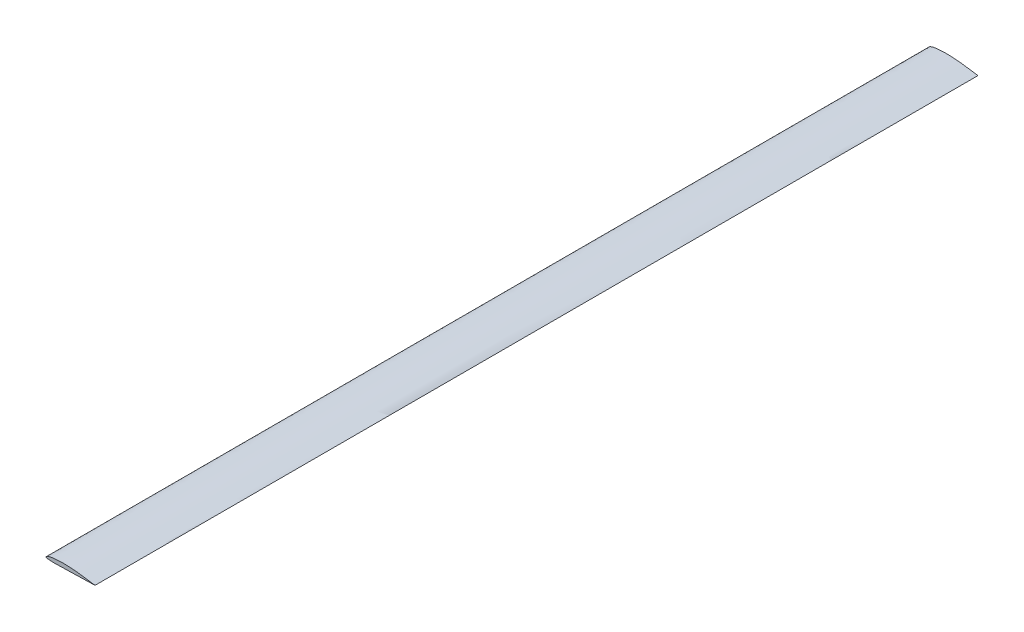
ISO-10303-21;
HEADER;
FILE_DESCRIPTION(('STEP AP214'),'2;1');
FILE_NAME('part.step','',(''),(''),'','','');
FILE_SCHEMA(('AUTOMOTIVE_DESIGN { 1 0 10303 214 1 1 1 1 }'));
ENDSEC;
DATA;
#1=APPLICATION_CONTEXT('core data for automotive mechanical design processes');
#2=APPLICATION_PROTOCOL_DEFINITION('international standard','automotive_design',2000,#1);
#3=PRODUCT_CONTEXT('',#1,'mechanical');
#4=PRODUCT('Part','Part','',(#3));
#5=PRODUCT_RELATED_PRODUCT_CATEGORY('part','',(#4));
#6=PRODUCT_DEFINITION_FORMATION('','',#4);
#7=PRODUCT_DEFINITION_CONTEXT('part definition',#1,'design');
#8=PRODUCT_DEFINITION('design','',#6,#7);
#9=PRODUCT_DEFINITION_SHAPE('','',#8);
#10=(LENGTH_UNIT() NAMED_UNIT(*) SI_UNIT(.MILLI.,.METRE.));
#11=(NAMED_UNIT(*) PLANE_ANGLE_UNIT() SI_UNIT($,.RADIAN.));
#12=(NAMED_UNIT(*) SI_UNIT($,.STERADIAN.) SOLID_ANGLE_UNIT());
#13=UNCERTAINTY_MEASURE_WITH_UNIT(LENGTH_MEASURE(1.E-05),#10,'distance_accuracy_value','');
#14=(GEOMETRIC_REPRESENTATION_CONTEXT(3) GLOBAL_UNCERTAINTY_ASSIGNED_CONTEXT((#13)) GLOBAL_UNIT_ASSIGNED_CONTEXT((#10,
#11,#12)) REPRESENTATION_CONTEXT('',''));
#15=CARTESIAN_POINT('',(0.,0.,0.));
#16=DIRECTION('',(0.,0.,1.));
#17=DIRECTION('',(1.,0.,0.));
#18=AXIS2_PLACEMENT_3D('',#15,#16,#17);
#19=CARTESIAN_POINT('',(100.,0.,1800.));
#20=CARTESIAN_POINT('',(100.000254641064,0.00484558403514791,1800.));
#21=CARTESIAN_POINT('',(99.3043680177313,0.0659172427162742,1800.));
#22=CARTESIAN_POINT('',(98.6021944157358,0.166377018560588,1800.));
#23=CARTESIAN_POINT('',(96.918548008515,0.388906994501685,1800.));
#24=CARTESIAN_POINT('',(94.8829592910099,0.699750822409785,1800.));
#25=CARTESIAN_POINT('',(92.2675532152623,1.10972830752757,1800.));
#26=CARTESIAN_POINT('',(89.23097009286,1.59862148310042,1800.));
#27=CARTESIAN_POINT('',(85.78462550643,2.15017112084556,1800.));
#28=CARTESIAN_POINT('',(81.9915082960778,2.7419608626601,1800.));
#29=CARTESIAN_POINT('',(77.8954350594476,3.34933896488036,1800.));
#30=CARTESIAN_POINT('',(73.5406459107368,3.94223123218436,1800.));
#31=CARTESIAN_POINT('',(68.9676784916926,4.49952269065716,1800.));
#32=CARTESIAN_POINT('',(64.2179819727134,5.0096802551403,1800.));
#33=CARTESIAN_POINT('',(59.3372171602971,5.46447968546526,1800.));
#34=CARTESIAN_POINT('',(54.3778423286441,5.8635646847153,1800.));
#35=CARTESIAN_POINT('',(49.3942829527537,6.19924573332197,1800.));
#36=CARTESIAN_POINT('',(44.4376342789293,6.45031033599208,1800.));
#37=CARTESIAN_POINT('',(39.5568952741308,6.60960139032306,1800.));
#38=CARTESIAN_POINT('',(34.799140518016,6.67753460827547,1800.));
#39=CARTESIAN_POINT('',(30.2086363583506,6.6419217555414,1800.));
#40=CARTESIAN_POINT('',(25.8275462132898,6.49845977427328,1800.));
#41=CARTESIAN_POINT('',(21.6950928276941,6.25923829685175,1800.));
#42=CARTESIAN_POINT('',(17.8490194127534,5.91915465339839,1800.));
#43=CARTESIAN_POINT('',(14.3225756868273,5.48085773216891,1800.));
#44=CARTESIAN_POINT('',(11.1430350117099,4.95342906709377,1800.));
#45=CARTESIAN_POINT('',(8.33415765974863,4.34780150034335,1800.));
#46=CARTESIAN_POINT('',(5.91525390339942,3.67525118075813,1800.));
#47=CARTESIAN_POINT('',(3.90093028346273,2.95452690488506,1800.));
#48=CARTESIAN_POINT('',(2.29763294623879,2.20609157500868,1800.));
#49=CARTESIAN_POINT('',(1.1174586923047,1.46215798867945,1800.));
#50=CARTESIAN_POINT('',(0.456151921435292,0.873206714044224,1800.));
#51=CARTESIAN_POINT('',(0.179984341542135,0.478870116531665,1800.));
#52=CARTESIAN_POINT('',(0.0816291495334136,0.304427913238103,1800.));
#53=CARTESIAN_POINT('',(0.0208996855884105,0.147654193562095,1800.));
#54=CARTESIAN_POINT('',(-0.00308642406208336,0.0240598128643202,1800.));
#55=CARTESIAN_POINT('',(0.00174362448764072,-0.0733318261748022,1800.));
#56=CARTESIAN_POINT('',(0.04944018475727,-0.160757083891578,1800.));
#57=CARTESIAN_POINT('',(0.138835818240352,-0.260917630534747,1800.));
#58=CARTESIAN_POINT('',(0.28210094189362,-0.377094962129115,1800.));
#59=CARTESIAN_POINT('',(0.628837255328547,-0.592457482017397,1800.));
#60=CARTESIAN_POINT('',(1.40102268690825,-0.907219245550617,1800.));
#61=CARTESIAN_POINT('',(2.75618762791911,-1.25634330721327,1800.));
#62=CARTESIAN_POINT('',(4.67491449368842,-1.57546951224213,1800.));
#63=CARTESIAN_POINT('',(7.07793489572215,-1.8364187098407,1800.));
#64=CARTESIAN_POINT('',(9.94833588995625,-2.03082163256713,1800.));
#65=CARTESIAN_POINT('',(13.2624184060062,-2.1586870397502,1800.));
#66=CARTESIAN_POINT('',(16.9912208887129,-2.22130892799472,1800.));
#67=CARTESIAN_POINT('',(21.0993380470373,-2.22398246285822,1800.));
#68=CARTESIAN_POINT('',(25.5455259002225,-2.17357109521817,1800.));
#69=CARTESIAN_POINT('',(30.2828811218771,-2.077862803822,1800.));
#70=CARTESIAN_POINT('',(35.2596980343087,-1.94451368439875,1800.));
#71=CARTESIAN_POINT('',(40.420676002307,-1.78112941886102,1800.));
#72=CARTESIAN_POINT('',(45.7076400948294,-1.595299131312,1800.));
#73=CARTESIAN_POINT('',(51.0605769844676,-1.39384644083995,1800.));
#74=CARTESIAN_POINT('',(56.4181222203069,-1.18495810531255,1800.));
#75=CARTESIAN_POINT('',(61.7180819287631,-0.975290492629348,1800.));
#76=CARTESIAN_POINT('',(66.8979997020047,-0.77323946443699,1800.));
#77=CARTESIAN_POINT('',(71.8956838917593,-0.584753468646859,1800.));
#78=CARTESIAN_POINT('',(76.6500332754564,-0.416097545608538,1800.));
#79=CARTESIAN_POINT('',(81.1020085323827,-0.271699710460844,1800.));
#80=CARTESIAN_POINT('',(85.1927904873101,-0.15695603731369,1800.));
#81=CARTESIAN_POINT('',(88.8721103632559,-0.0729226017637265,1800.));
#82=CARTESIAN_POINT('',(92.0755047506815,-0.0182971621091037,1800.));
#83=CARTESIAN_POINT('',(94.7979633908489,0.00862056185301042,1800.));
#84=CARTESIAN_POINT('',(96.8881087339374,0.0191235805972939,1800.));
#85=CARTESIAN_POINT('',(98.5944950140561,0.00842254837589407,1800.));
#86=CARTESIAN_POINT('',(99.3030021769214,0.0179642044648872,1800.));
#87=CARTESIAN_POINT('',(99.9997451289946,-0.00484995960461721,1800.));
#88=CARTESIAN_POINT('',(100.,0.,1800.));
#89=B_SPLINE_CURVE_WITH_KNOTS('',3,(#19,#20,#21,#22,#23,#24,#25,#26,#27,#28,#29,#30,#31,#32,#33,
#34,#35,#36,#37,#38,#39,#40,#41,#42,#43,#44,#45,#46,#47,#48,#49,#50,#51,#52,#53,#54,#55,#56,#57,
#58,#59,#60,#61,#62,#63,#64,#65,#66,#67,#68,#69,#70,#71,#72,#73,#74,#75,#76,#77,#78,#79,#80,#81,
#82,#83,#84,#85,#86,#87,#88),.UNSPECIFIED.,.T.,.F.,(4,1,1,1,1,1,1,1,1,1,1,1,1,1,1,1,1,1,1,1,1,1,
1,1,1,1,1,1,1,1,1,1,1,1,1,1,1,1,1,1,1,1,1,1,1,1,1,1,1,1,1,1,1,1,1,1,1,1,1,1,1,1,1,1,1,1,1,4),
(0.,0.00163100967529279,0.006435235004734,0.0142206692223634,0.0247656252579182,
0.0378267269580913,0.0531493478862453,0.0704735042826113,0.0895356944216796,0.110075427516268,
0.131859874985406,0.154692567294311,0.178371256169875,0.202679511873491,0.22736396068896,
0.252132687183434,0.276728350590027,0.300939435147841,0.324527110506369,0.347267376957691,
0.368991726016915,0.389507470720742,0.408628379551237,0.426224009291417,0.442178727529928,
0.456395551168158,0.4688051239249,0.479372317511659,0.488085518085538,0.494967923813924,
0.500033810265933,0.501035662602399,0.502094489523219,0.502996978480934,0.503512880218242,
0.503955825590444,0.504408894464655,0.504955422997044,0.50594262600694,0.507129613737027,
0.510997734788642,0.518231918904382,0.52784553190147,0.539808758125613,0.554055914736768,
0.570489591502225,0.588973674400973,0.609342058034304,0.631392896979107,0.654894033520888,
0.679589724771299,0.705203145434866,0.731446603653204,0.758020282196595,0.784619627763923,
0.81093562404957,0.836656652810421,0.861473352283136,0.885081474957591,0.90718794410531,
0.927507338219275,0.945765257215092,0.961711873943494,0.975121793215094,0.985796265959578,
0.993581185210361,0.998367517520586,1.),.UNSPECIFIED.);
#90=DIRECTION('',(0.,0.,-1.));
#91=VECTOR('',#90,1.);
#92=SURFACE_OF_LINEAR_EXTRUSION('',#89,#91);
#93=DIRECTION('',(0.,0.,-1.));
#94=VECTOR('',#93,1.);
#95=CARTESIAN_POINT('',(4.99990434529319,-1.59757357963664,1800.));
#96=LINE('',#95,#94);
#97=CARTESIAN_POINT('',(4.99990434529311,-1.59757357963666,895.));
#98=VERTEX_POINT('',#97);
#99=CARTESIAN_POINT('',(4.99990434529311,-1.59757357963664,905.));
#100=VERTEX_POINT('',#99);
#101=EDGE_CURVE('E50',#98,#100,#96,.F.);
#102=ORIENTED_EDGE('',*,*,#101,.T.);
#103=CARTESIAN_POINT('',(100.,0.,905.));
#104=CARTESIAN_POINT('',(100.000254641064,0.00484558403514791,905.));
#105=CARTESIAN_POINT('',(99.3043680177313,0.0659172427162742,905.));
#106=CARTESIAN_POINT('',(98.6021944157358,0.166377018560588,905.));
#107=CARTESIAN_POINT('',(96.918548008515,0.388906994501685,905.));
#108=CARTESIAN_POINT('',(94.8829592910099,0.699750822409785,905.));
#109=CARTESIAN_POINT('',(92.2675532152623,1.10972830752757,905.));
#110=CARTESIAN_POINT('',(89.23097009286,1.59862148310042,905.));
#111=CARTESIAN_POINT('',(85.78462550643,2.15017112084556,905.));
#112=CARTESIAN_POINT('',(81.9915082960778,2.7419608626601,905.));
#113=CARTESIAN_POINT('',(77.8954350594476,3.34933896488036,905.));
#114=CARTESIAN_POINT('',(73.5406459107368,3.94223123218436,905.));
#115=CARTESIAN_POINT('',(68.9676784916926,4.49952269065716,905.));
#116=CARTESIAN_POINT('',(64.2179819727134,5.0096802551403,905.));
#117=CARTESIAN_POINT('',(59.3372171602971,5.46447968546526,905.));
#118=CARTESIAN_POINT('',(54.3778423286441,5.8635646847153,905.));
#119=CARTESIAN_POINT('',(49.3942829527537,6.19924573332197,905.));
#120=CARTESIAN_POINT('',(44.4376342789293,6.45031033599208,905.));
#121=CARTESIAN_POINT('',(39.5568952741308,6.60960139032306,905.));
#122=CARTESIAN_POINT('',(34.799140518016,6.67753460827547,905.));
#123=CARTESIAN_POINT('',(30.2086363583506,6.6419217555414,905.));
#124=CARTESIAN_POINT('',(25.8275462132898,6.49845977427328,905.));
#125=CARTESIAN_POINT('',(21.6950928276941,6.25923829685175,905.));
#126=CARTESIAN_POINT('',(17.8490194127534,5.91915465339839,905.));
#127=CARTESIAN_POINT('',(14.3225756868273,5.48085773216891,905.));
#128=CARTESIAN_POINT('',(11.1430350117099,4.95342906709377,905.));
#129=CARTESIAN_POINT('',(8.33415765974863,4.34780150034335,905.));
#130=CARTESIAN_POINT('',(5.91525390339942,3.67525118075813,905.));
#131=CARTESIAN_POINT('',(3.90093028346273,2.95452690488506,905.));
#132=CARTESIAN_POINT('',(2.29763294623879,2.20609157500868,905.));
#133=CARTESIAN_POINT('',(1.1174586923047,1.46215798867945,905.));
#134=CARTESIAN_POINT('',(0.456151921435292,0.873206714044224,905.));
#135=CARTESIAN_POINT('',(0.179984341542135,0.478870116531665,905.));
#136=CARTESIAN_POINT('',(0.0816291495334136,0.304427913238103,905.));
#137=CARTESIAN_POINT('',(0.0208996855884105,0.147654193562095,905.));
#138=CARTESIAN_POINT('',(-0.00308642406208336,0.0240598128643202,905.));
#139=CARTESIAN_POINT('',(0.00174362448764072,-0.0733318261748022,905.));
#140=CARTESIAN_POINT('',(0.04944018475727,-0.160757083891578,905.));
#141=CARTESIAN_POINT('',(0.138835818240352,-0.260917630534747,905.));
#142=CARTESIAN_POINT('',(0.28210094189362,-0.377094962129115,905.));
#143=CARTESIAN_POINT('',(0.628837255328547,-0.592457482017397,905.));
#144=CARTESIAN_POINT('',(1.40102268690825,-0.907219245550617,905.));
#145=CARTESIAN_POINT('',(2.75618762791911,-1.25634330721327,905.));
#146=CARTESIAN_POINT('',(4.67491449368842,-1.57546951224213,905.));
#147=CARTESIAN_POINT('',(7.07793489572215,-1.8364187098407,905.));
#148=CARTESIAN_POINT('',(9.94833588995625,-2.03082163256713,905.));
#149=CARTESIAN_POINT('',(13.2624184060062,-2.1586870397502,905.));
#150=CARTESIAN_POINT('',(16.9912208887129,-2.22130892799472,905.));
#151=CARTESIAN_POINT('',(21.0993380470373,-2.22398246285822,905.));
#152=CARTESIAN_POINT('',(25.5455259002225,-2.17357109521817,905.));
#153=CARTESIAN_POINT('',(30.2828811218771,-2.077862803822,905.));
#154=CARTESIAN_POINT('',(35.2596980343087,-1.94451368439875,905.));
#155=CARTESIAN_POINT('',(40.420676002307,-1.78112941886102,905.));
#156=CARTESIAN_POINT('',(45.7076400948294,-1.595299131312,905.));
#157=CARTESIAN_POINT('',(51.0605769844676,-1.39384644083995,905.));
#158=CARTESIAN_POINT('',(56.4181222203069,-1.18495810531255,905.));
#159=CARTESIAN_POINT('',(61.7180819287631,-0.975290492629348,905.));
#160=CARTESIAN_POINT('',(66.8979997020047,-0.77323946443699,905.));
#161=CARTESIAN_POINT('',(71.8956838917593,-0.584753468646859,905.));
#162=CARTESIAN_POINT('',(76.6500332754564,-0.416097545608538,905.));
#163=CARTESIAN_POINT('',(81.1020085323827,-0.271699710460844,905.));
#164=CARTESIAN_POINT('',(85.1927904873101,-0.15695603731369,905.));
#165=CARTESIAN_POINT('',(88.8721103632559,-0.0729226017637265,905.));
#166=CARTESIAN_POINT('',(92.0755047506815,-0.0182971621091037,905.));
#167=CARTESIAN_POINT('',(94.7979633908489,0.00862056185301042,905.));
#168=CARTESIAN_POINT('',(96.8881087339374,0.0191235805972939,905.));
#169=CARTESIAN_POINT('',(98.5944950140561,0.00842254837589407,905.));
#170=CARTESIAN_POINT('',(99.3030021769214,0.0179642044648872,905.));
#171=CARTESIAN_POINT('',(99.9997451289946,-0.00484995960461721,905.));
#172=CARTESIAN_POINT('',(100.,0.,905.));
#173=B_SPLINE_CURVE_WITH_KNOTS('',3,(#103,#104,#105,#106,#107,#108,#109,#110,#111,#112,#113,
#114,#115,#116,#117,#118,#119,#120,#121,#122,#123,#124,#125,#126,#127,#128,#129,#130,#131,#132,
#133,#134,#135,#136,#137,#138,#139,#140,#141,#142,#143,#144,#145,#146,#147,#148,#149,#150,#151,
#152,#153,#154,#155,#156,#157,#158,#159,#160,#161,#162,#163,#164,#165,#166,#167,#168,#169,#170,
#171,#172),.UNSPECIFIED.,.T.,.F.,(4,1,1,1,1,1,1,1,1,1,1,1,1,1,1,1,1,1,1,1,1,1,1,1,1,1,1,1,1,1,1,
1,1,1,1,1,1,1,1,1,1,1,1,1,1,1,1,1,1,1,1,1,1,1,1,1,1,1,1,1,1,1,1,1,1,1,1,4),(0.,
0.00163100967529279,0.006435235004734,0.0142206692223634,0.0247656252579182,0.0378267269580913,
0.0531493478862453,0.0704735042826113,0.0895356944216796,0.110075427516268,0.131859874985406,
0.154692567294311,0.178371256169875,0.202679511873491,0.22736396068896,0.252132687183434,
0.276728350590027,0.300939435147841,0.324527110506369,0.347267376957691,0.368991726016915,
0.389507470720742,0.408628379551237,0.426224009291417,0.442178727529928,0.456395551168158,
0.4688051239249,0.479372317511659,0.488085518085538,0.494967923813924,0.500033810265933,
0.501035662602399,0.502094489523219,0.502996978480934,0.503512880218242,0.503955825590444,
0.504408894464655,0.504955422997044,0.50594262600694,0.507129613737027,0.510997734788642,
0.518231918904382,0.52784553190147,0.539808758125613,0.554055914736768,0.570489591502225,
0.588973674400973,0.609342058034304,0.631392896979107,0.654894033520888,0.679589724771299,
0.705203145434866,0.731446603653204,0.758020282196595,0.784619627763923,0.81093562404957,
0.836656652810421,0.861473352283136,0.885081474957591,0.90718794410531,0.927507338219275,
0.945765257215092,0.961711873943494,0.975121793215094,0.985796265959578,0.993581185210361,
0.998367517520586,1.),.UNSPECIFIED.);
#174=CARTESIAN_POINT('',(94.0037641861166,0.,905.));
#175=VERTEX_POINT('',#174);
#176=EDGE_CURVE('E11',#100,#175,#173,.T.);
#177=ORIENTED_EDGE('',*,*,#176,.T.);
#178=DIRECTION('',(0.,0.,-1.));
#179=VECTOR('',#178,1.);
#180=CARTESIAN_POINT('',(94.0037641861166,0.,1800.));
#181=LINE('',#180,#179);
#182=CARTESIAN_POINT('',(94.0037641861166,0.,895.));
#183=VERTEX_POINT('',#182);
#184=EDGE_CURVE('E143',#175,#183,#181,.T.);
#185=ORIENTED_EDGE('',*,*,#184,.T.);
#186=CARTESIAN_POINT('',(100.,0.,895.));
#187=CARTESIAN_POINT('',(100.000254641064,0.00484558403514791,895.));
#188=CARTESIAN_POINT('',(99.3043680177313,0.0659172427162742,895.));
#189=CARTESIAN_POINT('',(98.6021944157358,0.166377018560588,895.));
#190=CARTESIAN_POINT('',(96.918548008515,0.388906994501685,895.));
#191=CARTESIAN_POINT('',(94.8829592910099,0.699750822409785,895.));
#192=CARTESIAN_POINT('',(92.2675532152623,1.10972830752757,895.));
#193=CARTESIAN_POINT('',(89.23097009286,1.59862148310042,895.));
#194=CARTESIAN_POINT('',(85.78462550643,2.15017112084556,895.));
#195=CARTESIAN_POINT('',(81.9915082960778,2.7419608626601,895.));
#196=CARTESIAN_POINT('',(77.8954350594476,3.34933896488036,895.));
#197=CARTESIAN_POINT('',(73.5406459107368,3.94223123218436,895.));
#198=CARTESIAN_POINT('',(68.9676784916926,4.49952269065716,895.));
#199=CARTESIAN_POINT('',(64.2179819727134,5.0096802551403,895.));
#200=CARTESIAN_POINT('',(59.3372171602971,5.46447968546526,895.));
#201=CARTESIAN_POINT('',(54.3778423286441,5.8635646847153,895.));
#202=CARTESIAN_POINT('',(49.3942829527537,6.19924573332197,895.));
#203=CARTESIAN_POINT('',(44.4376342789293,6.45031033599208,895.));
#204=CARTESIAN_POINT('',(39.5568952741308,6.60960139032306,895.));
#205=CARTESIAN_POINT('',(34.799140518016,6.67753460827547,895.));
#206=CARTESIAN_POINT('',(30.2086363583506,6.6419217555414,895.));
#207=CARTESIAN_POINT('',(25.8275462132898,6.49845977427328,895.));
#208=CARTESIAN_POINT('',(21.6950928276941,6.25923829685175,895.));
#209=CARTESIAN_POINT('',(17.8490194127534,5.91915465339839,895.));
#210=CARTESIAN_POINT('',(14.3225756868273,5.48085773216891,895.));
#211=CARTESIAN_POINT('',(11.1430350117099,4.95342906709377,895.));
#212=CARTESIAN_POINT('',(8.33415765974863,4.34780150034335,895.));
#213=CARTESIAN_POINT('',(5.91525390339942,3.67525118075813,895.));
#214=CARTESIAN_POINT('',(3.90093028346273,2.95452690488506,895.));
#215=CARTESIAN_POINT('',(2.29763294623879,2.20609157500868,895.));
#216=CARTESIAN_POINT('',(1.1174586923047,1.46215798867945,895.));
#217=CARTESIAN_POINT('',(0.456151921435292,0.873206714044224,895.));
#218=CARTESIAN_POINT('',(0.179984341542135,0.478870116531665,895.));
#219=CARTESIAN_POINT('',(0.0816291495334136,0.304427913238103,895.));
#220=CARTESIAN_POINT('',(0.0208996855884105,0.147654193562095,895.));
#221=CARTESIAN_POINT('',(-0.00308642406208336,0.0240598128643202,895.));
#222=CARTESIAN_POINT('',(0.00174362448764072,-0.0733318261748022,895.));
#223=CARTESIAN_POINT('',(0.04944018475727,-0.160757083891578,895.));
#224=CARTESIAN_POINT('',(0.138835818240352,-0.260917630534747,895.));
#225=CARTESIAN_POINT('',(0.28210094189362,-0.377094962129115,895.));
#226=CARTESIAN_POINT('',(0.628837255328547,-0.592457482017397,895.));
#227=CARTESIAN_POINT('',(1.40102268690825,-0.907219245550617,895.));
#228=CARTESIAN_POINT('',(2.75618762791911,-1.25634330721327,895.));
#229=CARTESIAN_POINT('',(4.67491449368842,-1.57546951224213,895.));
#230=CARTESIAN_POINT('',(7.07793489572215,-1.8364187098407,895.));
#231=CARTESIAN_POINT('',(9.94833588995625,-2.03082163256713,895.));
#232=CARTESIAN_POINT('',(13.2624184060062,-2.1586870397502,895.));
#233=CARTESIAN_POINT('',(16.9912208887129,-2.22130892799472,895.));
#234=CARTESIAN_POINT('',(21.0993380470373,-2.22398246285822,895.));
#235=CARTESIAN_POINT('',(25.5455259002225,-2.17357109521817,895.));
#236=CARTESIAN_POINT('',(30.2828811218771,-2.077862803822,895.));
#237=CARTESIAN_POINT('',(35.2596980343087,-1.94451368439875,895.));
#238=CARTESIAN_POINT('',(40.420676002307,-1.78112941886102,895.));
#239=CARTESIAN_POINT('',(45.7076400948294,-1.595299131312,895.));
#240=CARTESIAN_POINT('',(51.0605769844676,-1.39384644083995,895.));
#241=CARTESIAN_POINT('',(56.4181222203069,-1.18495810531255,895.));
#242=CARTESIAN_POINT('',(61.7180819287631,-0.975290492629348,895.));
#243=CARTESIAN_POINT('',(66.8979997020047,-0.77323946443699,895.));
#244=CARTESIAN_POINT('',(71.8956838917593,-0.584753468646859,895.));
#245=CARTESIAN_POINT('',(76.6500332754564,-0.416097545608538,895.));
#246=CARTESIAN_POINT('',(81.1020085323827,-0.271699710460844,895.));
#247=CARTESIAN_POINT('',(85.1927904873101,-0.15695603731369,895.));
#248=CARTESIAN_POINT('',(88.8721103632559,-0.0729226017637265,895.));
#249=CARTESIAN_POINT('',(92.0755047506815,-0.0182971621091037,895.));
#250=CARTESIAN_POINT('',(94.7979633908489,0.00862056185301042,895.));
#251=CARTESIAN_POINT('',(96.8881087339374,0.0191235805972939,895.));
#252=CARTESIAN_POINT('',(98.5944950140561,0.00842254837589407,895.));
#253=CARTESIAN_POINT('',(99.3030021769214,0.0179642044648872,895.));
#254=CARTESIAN_POINT('',(99.9997451289946,-0.00484995960461721,895.));
#255=CARTESIAN_POINT('',(100.,0.,895.));
#256=B_SPLINE_CURVE_WITH_KNOTS('',3,(#186,#187,#188,#189,#190,#191,#192,#193,#194,#195,#196,
#197,#198,#199,#200,#201,#202,#203,#204,#205,#206,#207,#208,#209,#210,#211,#212,#213,#214,#215,
#216,#217,#218,#219,#220,#221,#222,#223,#224,#225,#226,#227,#228,#229,#230,#231,#232,#233,#234,
#235,#236,#237,#238,#239,#240,#241,#242,#243,#244,#245,#246,#247,#248,#249,#250,#251,#252,#253,
#254,#255),.UNSPECIFIED.,.T.,.F.,(4,1,1,1,1,1,1,1,1,1,1,1,1,1,1,1,1,1,1,1,1,1,1,1,1,1,1,1,1,1,1,
1,1,1,1,1,1,1,1,1,1,1,1,1,1,1,1,1,1,1,1,1,1,1,1,1,1,1,1,1,1,1,1,1,1,1,1,4),(0.,
0.00163100967529279,0.006435235004734,0.0142206692223634,0.0247656252579182,0.0378267269580913,
0.0531493478862453,0.0704735042826113,0.0895356944216796,0.110075427516268,0.131859874985406,
0.154692567294311,0.178371256169875,0.202679511873491,0.22736396068896,0.252132687183434,
0.276728350590027,0.300939435147841,0.324527110506369,0.347267376957691,0.368991726016915,
0.389507470720742,0.408628379551237,0.426224009291417,0.442178727529928,0.456395551168158,
0.4688051239249,0.479372317511659,0.488085518085538,0.494967923813924,0.500033810265933,
0.501035662602399,0.502094489523219,0.502996978480934,0.503512880218242,0.503955825590444,
0.504408894464655,0.504955422997044,0.50594262600694,0.507129613737027,0.510997734788642,
0.518231918904382,0.52784553190147,0.539808758125613,0.554055914736768,0.570489591502225,
0.588973674400973,0.609342058034304,0.631392896979107,0.654894033520888,0.679589724771299,
0.705203145434866,0.731446603653204,0.758020282196595,0.784619627763923,0.81093562404957,
0.836656652810421,0.861473352283136,0.885081474957591,0.90718794410531,0.927507338219275,
0.945765257215092,0.961711873943494,0.975121793215094,0.985796265959578,0.993581185210361,
0.998367517520586,1.),.UNSPECIFIED.);
#257=EDGE_CURVE('E158',#183,#98,#256,.F.);
#258=ORIENTED_EDGE('',*,*,#257,.T.);
#259=EDGE_LOOP('',(#102,#177,#185,#258));
#260=FACE_BOUND('',#259,.T.);
#261=CARTESIAN_POINT('',(100.,0.,1800.));
#262=VERTEX_POINT('',#261);
#263=EDGE_CURVE('E136',#262,#262,#89,.T.);
#264=ORIENTED_EDGE('',*,*,#263,.F.);
#265=EDGE_LOOP('',(#264));
#266=FACE_BOUND('',#265,.T.);
#267=CARTESIAN_POINT('',(100.,0.,0.));
#268=CARTESIAN_POINT('',(100.000254641064,0.00484558403514791,0.));
#269=CARTESIAN_POINT('',(99.3043680177313,0.0659172427162742,0.));
#270=CARTESIAN_POINT('',(98.6021944157358,0.166377018560588,0.));
#271=CARTESIAN_POINT('',(96.918548008515,0.388906994501685,0.));
#272=CARTESIAN_POINT('',(94.8829592910099,0.699750822409785,0.));
#273=CARTESIAN_POINT('',(92.2675532152623,1.10972830752757,0.));
#274=CARTESIAN_POINT('',(89.23097009286,1.59862148310042,0.));
#275=CARTESIAN_POINT('',(85.78462550643,2.15017112084556,0.));
#276=CARTESIAN_POINT('',(81.9915082960778,2.7419608626601,0.));
#277=CARTESIAN_POINT('',(77.8954350594476,3.34933896488036,0.));
#278=CARTESIAN_POINT('',(73.5406459107368,3.94223123218436,0.));
#279=CARTESIAN_POINT('',(68.9676784916926,4.49952269065716,0.));
#280=CARTESIAN_POINT('',(64.2179819727134,5.0096802551403,0.));
#281=CARTESIAN_POINT('',(59.3372171602971,5.46447968546526,0.));
#282=CARTESIAN_POINT('',(54.3778423286441,5.8635646847153,0.));
#283=CARTESIAN_POINT('',(49.3942829527537,6.19924573332197,0.));
#284=CARTESIAN_POINT('',(44.4376342789293,6.45031033599208,0.));
#285=CARTESIAN_POINT('',(39.5568952741308,6.60960139032306,0.));
#286=CARTESIAN_POINT('',(34.799140518016,6.67753460827547,0.));
#287=CARTESIAN_POINT('',(30.2086363583506,6.6419217555414,0.));
#288=CARTESIAN_POINT('',(25.8275462132898,6.49845977427328,0.));
#289=CARTESIAN_POINT('',(21.6950928276941,6.25923829685175,0.));
#290=CARTESIAN_POINT('',(17.8490194127534,5.91915465339839,0.));
#291=CARTESIAN_POINT('',(14.3225756868273,5.48085773216891,0.));
#292=CARTESIAN_POINT('',(11.1430350117099,4.95342906709377,0.));
#293=CARTESIAN_POINT('',(8.33415765974863,4.34780150034335,0.));
#294=CARTESIAN_POINT('',(5.91525390339942,3.67525118075813,0.));
#295=CARTESIAN_POINT('',(3.90093028346273,2.95452690488506,0.));
#296=CARTESIAN_POINT('',(2.29763294623879,2.20609157500868,0.));
#297=CARTESIAN_POINT('',(1.1174586923047,1.46215798867945,0.));
#298=CARTESIAN_POINT('',(0.456151921435292,0.873206714044224,0.));
#299=CARTESIAN_POINT('',(0.179984341542135,0.478870116531665,0.));
#300=CARTESIAN_POINT('',(0.0816291495334136,0.304427913238103,0.));
#301=CARTESIAN_POINT('',(0.0208996855884105,0.147654193562095,0.));
#302=CARTESIAN_POINT('',(-0.00308642406208336,0.0240598128643202,0.));
#303=CARTESIAN_POINT('',(0.00174362448764072,-0.0733318261748022,0.));
#304=CARTESIAN_POINT('',(0.04944018475727,-0.160757083891578,0.));
#305=CARTESIAN_POINT('',(0.138835818240352,-0.260917630534747,0.));
#306=CARTESIAN_POINT('',(0.28210094189362,-0.377094962129115,0.));
#307=CARTESIAN_POINT('',(0.628837255328547,-0.592457482017397,0.));
#308=CARTESIAN_POINT('',(1.40102268690825,-0.907219245550617,0.));
#309=CARTESIAN_POINT('',(2.75618762791911,-1.25634330721327,0.));
#310=CARTESIAN_POINT('',(4.67491449368842,-1.57546951224213,0.));
#311=CARTESIAN_POINT('',(7.07793489572215,-1.8364187098407,0.));
#312=CARTESIAN_POINT('',(9.94833588995625,-2.03082163256713,0.));
#313=CARTESIAN_POINT('',(13.2624184060062,-2.1586870397502,0.));
#314=CARTESIAN_POINT('',(16.9912208887129,-2.22130892799472,0.));
#315=CARTESIAN_POINT('',(21.0993380470373,-2.22398246285822,0.));
#316=CARTESIAN_POINT('',(25.5455259002225,-2.17357109521817,0.));
#317=CARTESIAN_POINT('',(30.2828811218771,-2.077862803822,0.));
#318=CARTESIAN_POINT('',(35.2596980343087,-1.94451368439875,0.));
#319=CARTESIAN_POINT('',(40.420676002307,-1.78112941886102,0.));
#320=CARTESIAN_POINT('',(45.7076400948294,-1.595299131312,0.));
#321=CARTESIAN_POINT('',(51.0605769844676,-1.39384644083995,0.));
#322=CARTESIAN_POINT('',(56.4181222203069,-1.18495810531255,0.));
#323=CARTESIAN_POINT('',(61.7180819287631,-0.975290492629348,0.));
#324=CARTESIAN_POINT('',(66.8979997020047,-0.77323946443699,0.));
#325=CARTESIAN_POINT('',(71.8956838917593,-0.584753468646859,0.));
#326=CARTESIAN_POINT('',(76.6500332754564,-0.416097545608538,0.));
#327=CARTESIAN_POINT('',(81.1020085323827,-0.271699710460844,0.));
#328=CARTESIAN_POINT('',(85.1927904873101,-0.15695603731369,0.));
#329=CARTESIAN_POINT('',(88.8721103632559,-0.0729226017637265,0.));
#330=CARTESIAN_POINT('',(92.0755047506815,-0.0182971621091037,0.));
#331=CARTESIAN_POINT('',(94.7979633908489,0.00862056185301042,0.));
#332=CARTESIAN_POINT('',(96.8881087339374,0.0191235805972939,0.));
#333=CARTESIAN_POINT('',(98.5944950140561,0.00842254837589407,0.));
#334=CARTESIAN_POINT('',(99.3030021769214,0.0179642044648872,0.));
#335=CARTESIAN_POINT('',(99.9997451289946,-0.00484995960461721,0.));
#336=CARTESIAN_POINT('',(100.,0.,0.));
#337=B_SPLINE_CURVE_WITH_KNOTS('',3,(#267,#268,#269,#270,#271,#272,#273,#274,#275,#276,#277,
#278,#279,#280,#281,#282,#283,#284,#285,#286,#287,#288,#289,#290,#291,#292,#293,#294,#295,#296,
#297,#298,#299,#300,#301,#302,#303,#304,#305,#306,#307,#308,#309,#310,#311,#312,#313,#314,#315,
#316,#317,#318,#319,#320,#321,#322,#323,#324,#325,#326,#327,#328,#329,#330,#331,#332,#333,#334,
#335,#336),.UNSPECIFIED.,.T.,.F.,(4,1,1,1,1,1,1,1,1,1,1,1,1,1,1,1,1,1,1,1,1,1,1,1,1,1,1,1,1,1,1,
1,1,1,1,1,1,1,1,1,1,1,1,1,1,1,1,1,1,1,1,1,1,1,1,1,1,1,1,1,1,1,1,1,1,1,1,4),(0.,
0.00163100967529279,0.006435235004734,0.0142206692223634,0.0247656252579182,0.0378267269580913,
0.0531493478862453,0.0704735042826113,0.0895356944216796,0.110075427516268,0.131859874985406,
0.154692567294311,0.178371256169875,0.202679511873491,0.22736396068896,0.252132687183434,
0.276728350590027,0.300939435147841,0.324527110506369,0.347267376957691,0.368991726016915,
0.389507470720742,0.408628379551237,0.426224009291417,0.442178727529928,0.456395551168158,
0.4688051239249,0.479372317511659,0.488085518085538,0.494967923813924,0.500033810265933,
0.501035662602399,0.502094489523219,0.502996978480934,0.503512880218242,0.503955825590444,
0.504408894464655,0.504955422997044,0.50594262600694,0.507129613737027,0.510997734788642,
0.518231918904382,0.52784553190147,0.539808758125613,0.554055914736768,0.570489591502225,
0.588973674400973,0.609342058034304,0.631392896979107,0.654894033520888,0.679589724771299,
0.705203145434866,0.731446603653204,0.758020282196595,0.784619627763923,0.81093562404957,
0.836656652810421,0.861473352283136,0.885081474957591,0.90718794410531,0.927507338219275,
0.945765257215092,0.961711873943494,0.975121793215094,0.985796265959578,0.993581185210361,
0.998367517520586,1.),.UNSPECIFIED.);
#338=CARTESIAN_POINT('',(100.,0.,0.));
#339=VERTEX_POINT('',#338);
#340=EDGE_CURVE('E131',#339,#339,#337,.T.);
#341=ORIENTED_EDGE('',*,*,#340,.T.);
#342=EDGE_LOOP('',(#341));
#343=FACE_BOUND('',#342,.T.);
#344=ADVANCED_FACE('F39',(#260,#266,#343),#92,.F.);
#345=CARTESIAN_POINT('',(0.304843801490973,0.65214189515017,1800.));
#346=DIRECTION('',(0.,0.,-1.));
#347=DIRECTION('',(-1.,0.,0.));
#348=AXIS2_PLACEMENT_3D('',#345,#346,#347);
#349=PLANE('',#348);
#350=ORIENTED_EDGE('',*,*,#263,.T.);
#351=EDGE_LOOP('',(#350));
#352=FACE_BOUND('',#351,.T.);
#353=ADVANCED_FACE('F182',(#352),#349,.F.);
#354=CARTESIAN_POINT('',(0.304843801490973,0.65214189515017,0.));
#355=DIRECTION('',(0.,0.,-1.));
#356=DIRECTION('',(-1.,0.,0.));
#357=AXIS2_PLACEMENT_3D('',#354,#355,#356);
#358=PLANE('',#357);
#359=ORIENTED_EDGE('',*,*,#340,.F.);
#360=EDGE_LOOP('',(#359));
#361=FACE_BOUND('',#360,.T.);
#362=ADVANCED_FACE('F175',(#361),#358,.T.);
#363=CARTESIAN_POINT('',(4.99990434529311,-5.,905.));
#364=DIRECTION('',(0.,0.,1.));
#365=DIRECTION('',(1.,0.,0.));
#366=AXIS2_PLACEMENT_3D('',#363,#364,#365);
#367=PLANE('',#366);
#368=ORIENTED_EDGE('',*,*,#176,.F.);
#369=DIRECTION('',(0.,1.,0.));
#370=VECTOR('',#369,1.);
#371=CARTESIAN_POINT('',(4.99990434529311,-5.,905.));
#372=LINE('',#371,#370);
#373=CARTESIAN_POINT('',(4.99990434529311,-5.,905.));
#374=VERTEX_POINT('',#373);
#375=EDGE_CURVE('E132',#374,#100,#372,.T.);
#376=ORIENTED_EDGE('',*,*,#375,.F.);
#377=DIRECTION('',(1.,0.,0.));
#378=VECTOR('',#377,1.);
#379=CARTESIAN_POINT('',(4.99990434529311,-5.,905.));
#380=LINE('',#379,#378);
#381=CARTESIAN_POINT('',(94.9999043452931,-5.,905.));
#382=VERTEX_POINT('',#381);
#383=EDGE_CURVE('E98',#374,#382,#380,.T.);
#384=ORIENTED_EDGE('',*,*,#383,.T.);
#385=DIRECTION('',(0.,1.,0.));
#386=VECTOR('',#385,1.);
#387=CARTESIAN_POINT('',(94.9999043452931,-5.,905.));
#388=LINE('',#387,#386);
#389=CARTESIAN_POINT('',(94.9999043452931,0.,905.));
#390=VERTEX_POINT('',#389);
#391=EDGE_CURVE('E113',#382,#390,#388,.T.);
#392=ORIENTED_EDGE('',*,*,#391,.T.);
#393=DIRECTION('',(1.,0.,0.));
#394=VECTOR('',#393,1.);
#395=CARTESIAN_POINT('',(4.99990434529311,0.,905.));
#396=LINE('',#395,#394);
#397=EDGE_CURVE('E115',#175,#390,#396,.T.);
#398=ORIENTED_EDGE('',*,*,#397,.F.);
#399=EDGE_LOOP('',(#368,#376,#384,#392,#398));
#400=FACE_BOUND('',#399,.T.);
#401=ADVANCED_FACE('F173',(#400),#367,.T.);
#402=CARTESIAN_POINT('',(4.99990434529311,-5.,895.));
#403=DIRECTION('',(-1.,0.,0.));
#404=DIRECTION('',(0.,0.,1.));
#405=AXIS2_PLACEMENT_3D('',#402,#403,#404);
#406=PLANE('',#405);
#407=ORIENTED_EDGE('',*,*,#101,.F.);
#408=DIRECTION('',(0.,1.,0.));
#409=VECTOR('',#408,1.);
#410=CARTESIAN_POINT('',(4.99990434529311,-5.,895.));
#411=LINE('',#410,#409);
#412=CARTESIAN_POINT('',(4.99990434529311,-5.,895.));
#413=VERTEX_POINT('',#412);
#414=EDGE_CURVE('E97',#413,#98,#411,.T.);
#415=ORIENTED_EDGE('',*,*,#414,.F.);
#416=DIRECTION('',(0.,0.,1.));
#417=VECTOR('',#416,1.);
#418=CARTESIAN_POINT('',(4.99990434529311,-5.,895.));
#419=LINE('',#418,#417);
#420=EDGE_CURVE('E108',#413,#374,#419,.T.);
#421=ORIENTED_EDGE('',*,*,#420,.T.);
#422=ORIENTED_EDGE('',*,*,#375,.T.);
#423=EDGE_LOOP('',(#407,#415,#421,#422));
#424=FACE_BOUND('',#423,.T.);
#425=ADVANCED_FACE('F171',(#424),#406,.T.);
#426=CARTESIAN_POINT('',(4.99990434529311,-5.,895.));
#427=DIRECTION('',(0.,0.,-1.));
#428=DIRECTION('',(-1.,0.,0.));
#429=AXIS2_PLACEMENT_3D('',#426,#427,#428);
#430=PLANE('',#429);
#431=ORIENTED_EDGE('',*,*,#257,.F.);
#432=DIRECTION('',(-1.,0.,0.));
#433=VECTOR('',#432,1.);
#434=CARTESIAN_POINT('',(4.99990434529311,0.,895.));
#435=LINE('',#434,#433);
#436=CARTESIAN_POINT('',(94.9999043452931,0.,895.));
#437=VERTEX_POINT('',#436);
#438=EDGE_CURVE('E57',#437,#183,#435,.T.);
#439=ORIENTED_EDGE('',*,*,#438,.F.);
#440=DIRECTION('',(0.,1.,0.));
#441=VECTOR('',#440,1.);
#442=CARTESIAN_POINT('',(94.9999043452931,-5.,895.));
#443=LINE('',#442,#441);
#444=CARTESIAN_POINT('',(94.9999043452931,-5.,895.));
#445=VERTEX_POINT('',#444);
#446=EDGE_CURVE('E88',#445,#437,#443,.T.);
#447=ORIENTED_EDGE('',*,*,#446,.F.);
#448=DIRECTION('',(-1.,0.,0.));
#449=VECTOR('',#448,1.);
#450=CARTESIAN_POINT('',(4.99990434529311,-5.,895.));
#451=LINE('',#450,#449);
#452=EDGE_CURVE('E92',#445,#413,#451,.T.);
#453=ORIENTED_EDGE('',*,*,#452,.T.);
#454=ORIENTED_EDGE('',*,*,#414,.T.);
#455=EDGE_LOOP('',(#431,#439,#447,#453,#454));
#456=FACE_BOUND('',#455,.T.);
#457=ADVANCED_FACE('F90',(#456),#430,.T.);
#458=CARTESIAN_POINT('',(0.,0.,0.));
#459=DIRECTION('',(0.,1.,0.));
#460=DIRECTION('',(0.,0.,1.));
#461=AXIS2_PLACEMENT_3D('',#458,#459,#460);
#462=PLANE('',#461);
#463=ORIENTED_EDGE('',*,*,#184,.F.);
#464=ORIENTED_EDGE('',*,*,#397,.T.);
#465=DIRECTION('',(0.,0.,-1.));
#466=VECTOR('',#465,1.);
#467=CARTESIAN_POINT('',(94.9999043452931,0.,895.));
#468=LINE('',#467,#466);
#469=EDGE_CURVE('E124',#390,#437,#468,.T.);
#470=ORIENTED_EDGE('',*,*,#469,.T.);
#471=ORIENTED_EDGE('',*,*,#438,.T.);
#472=EDGE_LOOP('',(#463,#464,#470,#471));
#473=FACE_BOUND('',#472,.T.);
#474=ADVANCED_FACE('F172',(#473),#462,.T.);
#475=CARTESIAN_POINT('',(94.9999043452931,-5.,895.));
#476=DIRECTION('',(1.,0.,0.));
#477=DIRECTION('',(0.,0.,-1.));
#478=AXIS2_PLACEMENT_3D('',#475,#476,#477);
#479=PLANE('',#478);
#480=ORIENTED_EDGE('',*,*,#469,.F.);
#481=ORIENTED_EDGE('',*,*,#391,.F.);
#482=DIRECTION('',(0.,0.,-1.));
#483=VECTOR('',#482,1.);
#484=CARTESIAN_POINT('',(94.9999043452931,-5.,895.));
#485=LINE('',#484,#483);
#486=EDGE_CURVE('E105',#382,#445,#485,.T.);
#487=ORIENTED_EDGE('',*,*,#486,.T.);
#488=ORIENTED_EDGE('',*,*,#446,.T.);
#489=EDGE_LOOP('',(#480,#481,#487,#488));
#490=FACE_BOUND('',#489,.T.);
#491=ADVANCED_FACE('F111',(#490),#479,.T.);
#492=CARTESIAN_POINT('',(0.,-5.,0.));
#493=DIRECTION('',(0.,1.,0.));
#494=DIRECTION('',(0.,0.,1.));
#495=AXIS2_PLACEMENT_3D('',#492,#493,#494);
#496=PLANE('',#495);
#497=ORIENTED_EDGE('',*,*,#486,.F.);
#498=ORIENTED_EDGE('',*,*,#383,.F.);
#499=ORIENTED_EDGE('',*,*,#420,.F.);
#500=ORIENTED_EDGE('',*,*,#452,.F.);
#501=EDGE_LOOP('',(#497,#498,#499,#500));
#502=FACE_BOUND('',#501,.T.);
#503=ADVANCED_FACE('F103',(#502),#496,.F.);
#504=CLOSED_SHELL('',(#344,#353,#362,#401,#425,#457,#474,#491,#503));
#505=MANIFOLD_SOLID_BREP('B2',#504);
#506=ADVANCED_BREP_SHAPE_REPRESENTATION('',(#18,#505),#14);
#507=SHAPE_DEFINITION_REPRESENTATION(#9,#506);
ENDSEC;
END-ISO-10303-21;
